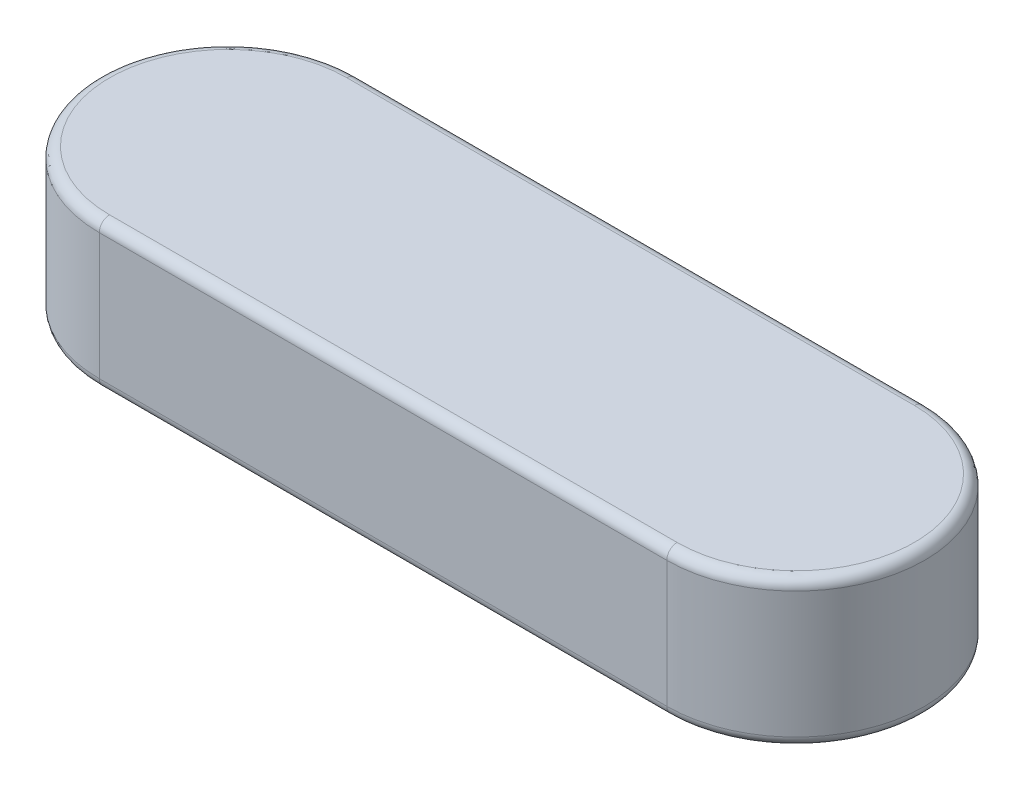
ISO-10303-21;
HEADER;
FILE_DESCRIPTION(('STEP AP214'),'2;1');
FILE_NAME('part.step','',(''),(''),'','','');
FILE_SCHEMA(('AUTOMOTIVE_DESIGN { 1 0 10303 214 1 1 1 1 }'));
ENDSEC;
DATA;
#1=APPLICATION_CONTEXT('core data for automotive mechanical design processes');
#2=APPLICATION_PROTOCOL_DEFINITION('international standard','automotive_design',2000,#1);
#3=PRODUCT_CONTEXT('',#1,'mechanical');
#4=PRODUCT('Part','Part','',(#3));
#5=PRODUCT_RELATED_PRODUCT_CATEGORY('part','',(#4));
#6=PRODUCT_DEFINITION_FORMATION('','',#4);
#7=PRODUCT_DEFINITION_CONTEXT('part definition',#1,'design');
#8=PRODUCT_DEFINITION('design','',#6,#7);
#9=PRODUCT_DEFINITION_SHAPE('','',#8);
#10=(LENGTH_UNIT() NAMED_UNIT(*) SI_UNIT(.MILLI.,.METRE.));
#11=(NAMED_UNIT(*) PLANE_ANGLE_UNIT() SI_UNIT($,.RADIAN.));
#12=(NAMED_UNIT(*) SI_UNIT($,.STERADIAN.) SOLID_ANGLE_UNIT());
#13=UNCERTAINTY_MEASURE_WITH_UNIT(LENGTH_MEASURE(1.E-05),#10,'distance_accuracy_value','');
#14=(GEOMETRIC_REPRESENTATION_CONTEXT(3) GLOBAL_UNCERTAINTY_ASSIGNED_CONTEXT((#13)) GLOBAL_UNIT_ASSIGNED_CONTEXT((#10,
#11,#12)) REPRESENTATION_CONTEXT('',''));
#15=CARTESIAN_POINT('',(0.,0.,0.));
#16=DIRECTION('',(0.,0.,1.));
#17=DIRECTION('',(1.,0.,0.));
#18=AXIS2_PLACEMENT_3D('',#15,#16,#17);
#19=CARTESIAN_POINT('',(-22.,5.7,0.));
#20=DIRECTION('',(0.,-1.,0.));
#21=DIRECTION('',(0.,0.,-1.));
#22=AXIS2_PLACEMENT_3D('',#19,#20,#21);
#23=CYLINDRICAL_SURFACE('',#22,5.);
#24=DIRECTION('',(0.,-1.,0.));
#25=VECTOR('',#24,1.);
#26=CARTESIAN_POINT('',(-22.,5.7,-5.));
#27=LINE('',#26,#25);
#28=CARTESIAN_POINT('',(-22.,5.3,-5.));
#29=VERTEX_POINT('',#28);
#30=CARTESIAN_POINT('',(-22.,0.4,-5.));
#31=VERTEX_POINT('',#30);
#32=EDGE_CURVE('E106',#29,#31,#27,.T.);
#33=ORIENTED_EDGE('',*,*,#32,.T.);
#34=CARTESIAN_POINT('',(-22.,0.4,0.));
#35=DIRECTION('',(0.,1.,0.));
#36=DIRECTION('',(0.,0.,1.));
#37=AXIS2_PLACEMENT_3D('',#34,#35,#36);
#38=CIRCLE('',#37,5.);
#39=CARTESIAN_POINT('',(-22.,0.4,5.));
#40=VERTEX_POINT('',#39);
#41=EDGE_CURVE('E113',#31,#40,#38,.T.);
#42=ORIENTED_EDGE('',*,*,#41,.T.);
#43=DIRECTION('',(0.,-1.,0.));
#44=VECTOR('',#43,1.);
#45=CARTESIAN_POINT('',(-22.,5.7,5.));
#46=LINE('',#45,#44);
#47=CARTESIAN_POINT('',(-22.,5.3,5.));
#48=VERTEX_POINT('',#47);
#49=EDGE_CURVE('E108',#48,#40,#46,.T.);
#50=ORIENTED_EDGE('',*,*,#49,.F.);
#51=CARTESIAN_POINT('',(-22.,5.3,0.));
#52=DIRECTION('',(0.,1.,0.));
#53=DIRECTION('',(0.,0.,1.));
#54=AXIS2_PLACEMENT_3D('',#51,#52,#53);
#55=CIRCLE('',#54,5.);
#56=EDGE_CURVE('E104',#48,#29,#55,.F.);
#57=ORIENTED_EDGE('',*,*,#56,.T.);
#58=EDGE_LOOP('',(#33,#42,#50,#57));
#59=FACE_BOUND('',#58,.T.);
#60=ADVANCED_FACE('F35',(#59),#23,.T.);
#61=CARTESIAN_POINT('',(-22.,5.7,5.));
#62=DIRECTION('',(0.,0.,-1.));
#63=DIRECTION('',(-1.,0.,0.));
#64=AXIS2_PLACEMENT_3D('',#61,#62,#63);
#65=PLANE('',#64);
#66=ORIENTED_EDGE('',*,*,#49,.T.);
#67=DIRECTION('',(1.,0.,0.));
#68=VECTOR('',#67,1.);
#69=CARTESIAN_POINT('',(-22.,0.4,5.));
#70=LINE('',#69,#68);
#71=CARTESIAN_POINT('',(0.,0.4,5.));
#72=VERTEX_POINT('',#71);
#73=EDGE_CURVE('E157',#40,#72,#70,.T.);
#74=ORIENTED_EDGE('',*,*,#73,.T.);
#75=DIRECTION('',(0.,-1.,0.));
#76=VECTOR('',#75,1.);
#77=CARTESIAN_POINT('',(0.,5.7,5.));
#78=LINE('',#77,#76);
#79=CARTESIAN_POINT('',(0.,5.3,5.));
#80=VERTEX_POINT('',#79);
#81=EDGE_CURVE('E138',#80,#72,#78,.T.);
#82=ORIENTED_EDGE('',*,*,#81,.F.);
#83=DIRECTION('',(1.,0.,0.));
#84=VECTOR('',#83,1.);
#85=CARTESIAN_POINT('',(-22.,5.3,5.));
#86=LINE('',#85,#84);
#87=EDGE_CURVE('E155',#80,#48,#86,.F.);
#88=ORIENTED_EDGE('',*,*,#87,.T.);
#89=EDGE_LOOP('',(#66,#74,#82,#88));
#90=FACE_BOUND('',#89,.T.);
#91=ADVANCED_FACE('F183',(#90),#65,.F.);
#92=CARTESIAN_POINT('',(0.,5.7,0.));
#93=DIRECTION('',(0.,-1.,0.));
#94=DIRECTION('',(0.,0.,-1.));
#95=AXIS2_PLACEMENT_3D('',#92,#93,#94);
#96=CYLINDRICAL_SURFACE('',#95,5.);
#97=ORIENTED_EDGE('',*,*,#81,.T.);
#98=CARTESIAN_POINT('',(0.,0.4,0.));
#99=DIRECTION('',(0.,1.,0.));
#100=DIRECTION('',(0.,0.,1.));
#101=AXIS2_PLACEMENT_3D('',#98,#99,#100);
#102=CIRCLE('',#101,5.);
#103=CARTESIAN_POINT('',(0.,0.4,-5.));
#104=VERTEX_POINT('',#103);
#105=EDGE_CURVE('E114',#72,#104,#102,.T.);
#106=ORIENTED_EDGE('',*,*,#105,.T.);
#107=DIRECTION('',(0.,-1.,0.));
#108=VECTOR('',#107,1.);
#109=CARTESIAN_POINT('',(0.,5.7,-5.));
#110=LINE('',#109,#108);
#111=CARTESIAN_POINT('',(0.,5.3,-5.));
#112=VERTEX_POINT('',#111);
#113=EDGE_CURVE('E125',#112,#104,#110,.T.);
#114=ORIENTED_EDGE('',*,*,#113,.F.);
#115=CARTESIAN_POINT('',(0.,5.3,0.));
#116=DIRECTION('',(0.,1.,0.));
#117=DIRECTION('',(0.,0.,1.));
#118=AXIS2_PLACEMENT_3D('',#115,#116,#117);
#119=CIRCLE('',#118,5.);
#120=EDGE_CURVE('E150',#112,#80,#119,.F.);
#121=ORIENTED_EDGE('',*,*,#120,.T.);
#122=EDGE_LOOP('',(#97,#106,#114,#121));
#123=FACE_BOUND('',#122,.T.);
#124=ADVANCED_FACE('F181',(#123),#96,.T.);
#125=CARTESIAN_POINT('',(-22.,5.7,-5.));
#126=DIRECTION('',(0.,0.,1.));
#127=DIRECTION('',(1.,0.,0.));
#128=AXIS2_PLACEMENT_3D('',#125,#126,#127);
#129=PLANE('',#128);
#130=ORIENTED_EDGE('',*,*,#113,.T.);
#131=DIRECTION('',(-1.,0.,0.));
#132=VECTOR('',#131,1.);
#133=CARTESIAN_POINT('',(-22.,0.4,-5.));
#134=LINE('',#133,#132);
#135=EDGE_CURVE('E124',#104,#31,#134,.T.);
#136=ORIENTED_EDGE('',*,*,#135,.T.);
#137=ORIENTED_EDGE('',*,*,#32,.F.);
#138=DIRECTION('',(-1.,0.,0.));
#139=VECTOR('',#138,1.);
#140=CARTESIAN_POINT('',(0.,5.3,-5.));
#141=LINE('',#140,#139);
#142=EDGE_CURVE('E121',#29,#112,#141,.F.);
#143=ORIENTED_EDGE('',*,*,#142,.T.);
#144=EDGE_LOOP('',(#130,#136,#137,#143));
#145=FACE_BOUND('',#144,.T.);
#146=ADVANCED_FACE('F119',(#145),#129,.F.);
#147=CARTESIAN_POINT('',(-22.,5.7,0.));
#148=DIRECTION('',(0.,1.,0.));
#149=DIRECTION('',(0.,0.,1.));
#150=AXIS2_PLACEMENT_3D('',#147,#148,#149);
#151=PLANE('',#150);
#152=DIRECTION('',(1.,0.,0.));
#153=VECTOR('',#152,1.);
#154=CARTESIAN_POINT('',(0.,5.7,4.6));
#155=LINE('',#154,#153);
#156=CARTESIAN_POINT('',(-22.,5.7,4.6));
#157=VERTEX_POINT('',#156);
#158=CARTESIAN_POINT('',(0.,5.7,4.6));
#159=VERTEX_POINT('',#158);
#160=EDGE_CURVE('E44',#157,#159,#155,.T.);
#161=ORIENTED_EDGE('',*,*,#160,.T.);
#162=CARTESIAN_POINT('',(0.,5.7,0.));
#163=DIRECTION('',(0.,1.,0.));
#164=DIRECTION('',(0.,0.,1.));
#165=AXIS2_PLACEMENT_3D('',#162,#163,#164);
#166=CIRCLE('',#165,4.6);
#167=CARTESIAN_POINT('',(0.,5.7,-4.6));
#168=VERTEX_POINT('',#167);
#169=EDGE_CURVE('E11',#159,#168,#166,.T.);
#170=ORIENTED_EDGE('',*,*,#169,.T.);
#171=DIRECTION('',(-1.,0.,0.));
#172=VECTOR('',#171,1.);
#173=CARTESIAN_POINT('',(-22.,5.7,-4.6));
#174=LINE('',#173,#172);
#175=CARTESIAN_POINT('',(-22.,5.7,-4.6));
#176=VERTEX_POINT('',#175);
#177=EDGE_CURVE('E160',#168,#176,#174,.T.);
#178=ORIENTED_EDGE('',*,*,#177,.T.);
#179=CARTESIAN_POINT('',(-22.,5.7,0.));
#180=DIRECTION('',(0.,1.,0.));
#181=DIRECTION('',(0.,0.,1.));
#182=AXIS2_PLACEMENT_3D('',#179,#180,#181);
#183=CIRCLE('',#182,4.6);
#184=EDGE_CURVE('E131',#176,#157,#183,.T.);
#185=ORIENTED_EDGE('',*,*,#184,.T.);
#186=EDGE_LOOP('',(#161,#170,#178,#185));
#187=FACE_BOUND('',#186,.T.);
#188=ADVANCED_FACE('F206',(#187),#151,.T.);
#189=CARTESIAN_POINT('',(-22.,0.,0.));
#190=DIRECTION('',(0.,1.,0.));
#191=DIRECTION('',(0.,0.,1.));
#192=AXIS2_PLACEMENT_3D('',#189,#190,#191);
#193=PLANE('',#192);
#194=CARTESIAN_POINT('',(-22.,0.,0.));
#195=DIRECTION('',(0.,1.,0.));
#196=DIRECTION('',(0.,0.,1.));
#197=AXIS2_PLACEMENT_3D('',#194,#195,#196);
#198=CIRCLE('',#197,4.6);
#199=CARTESIAN_POINT('',(-22.,0.,4.6));
#200=VERTEX_POINT('',#199);
#201=CARTESIAN_POINT('',(-22.,0.,-4.6));
#202=VERTEX_POINT('',#201);
#203=EDGE_CURVE('E143',#200,#202,#198,.F.);
#204=ORIENTED_EDGE('',*,*,#203,.T.);
#205=DIRECTION('',(-1.,0.,0.));
#206=VECTOR('',#205,1.);
#207=CARTESIAN_POINT('',(-22.,0.,-4.6));
#208=LINE('',#207,#206);
#209=CARTESIAN_POINT('',(0.,0.,-4.6));
#210=VERTEX_POINT('',#209);
#211=EDGE_CURVE('E147',#202,#210,#208,.F.);
#212=ORIENTED_EDGE('',*,*,#211,.T.);
#213=CARTESIAN_POINT('',(0.,0.,0.));
#214=DIRECTION('',(0.,1.,0.));
#215=DIRECTION('',(0.,0.,1.));
#216=AXIS2_PLACEMENT_3D('',#213,#214,#215);
#217=CIRCLE('',#216,4.6);
#218=CARTESIAN_POINT('',(0.,0.,4.6));
#219=VERTEX_POINT('',#218);
#220=EDGE_CURVE('E145',#210,#219,#217,.F.);
#221=ORIENTED_EDGE('',*,*,#220,.T.);
#222=DIRECTION('',(1.,0.,0.));
#223=VECTOR('',#222,1.);
#224=CARTESIAN_POINT('',(-22.,0.,4.6));
#225=LINE('',#224,#223);
#226=EDGE_CURVE('E136',#219,#200,#225,.F.);
#227=ORIENTED_EDGE('',*,*,#226,.T.);
#228=EDGE_LOOP('',(#204,#212,#221,#227));
#229=FACE_BOUND('',#228,.T.);
#230=ADVANCED_FACE('F204',(#229),#193,.F.);
#231=CARTESIAN_POINT('',(-22.,0.4,4.6));
#232=DIRECTION('',(1.,0.,0.));
#233=DIRECTION('',(0.,0.,-1.));
#234=AXIS2_PLACEMENT_3D('',#231,#232,#233);
#235=CYLINDRICAL_SURFACE('',#234,0.4);
#236=CARTESIAN_POINT('',(-22.,0.4,4.6));
#237=DIRECTION('',(-1.,0.,0.));
#238=DIRECTION('',(0.,0.,1.));
#239=AXIS2_PLACEMENT_3D('',#236,#237,#238);
#240=CIRCLE('',#239,0.4);
#241=EDGE_CURVE('E167',#200,#40,#240,.T.);
#242=ORIENTED_EDGE('',*,*,#241,.F.);
#243=ORIENTED_EDGE('',*,*,#226,.F.);
#244=CARTESIAN_POINT('',(0.,0.4,4.6));
#245=DIRECTION('',(1.,0.,0.));
#246=DIRECTION('',(0.,0.,-1.));
#247=AXIS2_PLACEMENT_3D('',#244,#245,#246);
#248=CIRCLE('',#247,0.4);
#249=EDGE_CURVE('E126',#72,#219,#248,.T.);
#250=ORIENTED_EDGE('',*,*,#249,.F.);
#251=ORIENTED_EDGE('',*,*,#73,.F.);
#252=EDGE_LOOP('',(#242,#243,#250,#251));
#253=FACE_BOUND('',#252,.T.);
#254=ADVANCED_FACE('F201',(#253),#235,.T.);
#255=CARTESIAN_POINT('',(0.,0.4,0.));
#256=DIRECTION('',(0.,1.,0.));
#257=DIRECTION('',(0.,0.,1.));
#258=AXIS2_PLACEMENT_3D('',#255,#256,#257);
#259=TOROIDAL_SURFACE('',#258,4.6,0.4);
#260=ORIENTED_EDGE('',*,*,#249,.T.);
#261=ORIENTED_EDGE('',*,*,#220,.F.);
#262=CARTESIAN_POINT('',(0.,0.4,-4.6));
#263=DIRECTION('',(-1.,0.,0.));
#264=DIRECTION('',(0.,0.,1.));
#265=AXIS2_PLACEMENT_3D('',#262,#263,#264);
#266=CIRCLE('',#265,0.4);
#267=EDGE_CURVE('E165',#104,#210,#266,.T.);
#268=ORIENTED_EDGE('',*,*,#267,.F.);
#269=ORIENTED_EDGE('',*,*,#105,.F.);
#270=EDGE_LOOP('',(#260,#261,#268,#269));
#271=FACE_BOUND('',#270,.T.);
#272=ADVANCED_FACE('F190',(#271),#259,.T.);
#273=CARTESIAN_POINT('',(-22.,0.4,0.));
#274=DIRECTION('',(0.,1.,0.));
#275=DIRECTION('',(0.,0.,1.));
#276=AXIS2_PLACEMENT_3D('',#273,#274,#275);
#277=TOROIDAL_SURFACE('',#276,4.6,0.4);
#278=ORIENTED_EDGE('',*,*,#241,.T.);
#279=ORIENTED_EDGE('',*,*,#41,.F.);
#280=CARTESIAN_POINT('',(-22.,0.4,-4.6));
#281=DIRECTION('',(1.,0.,0.));
#282=DIRECTION('',(0.,0.,-1.));
#283=AXIS2_PLACEMENT_3D('',#280,#281,#282);
#284=CIRCLE('',#283,0.4);
#285=EDGE_CURVE('E163',#202,#31,#284,.T.);
#286=ORIENTED_EDGE('',*,*,#285,.F.);
#287=ORIENTED_EDGE('',*,*,#203,.F.);
#288=EDGE_LOOP('',(#278,#279,#286,#287));
#289=FACE_BOUND('',#288,.T.);
#290=ADVANCED_FACE('F198',(#289),#277,.T.);
#291=CARTESIAN_POINT('',(-22.,0.4,-4.6));
#292=DIRECTION('',(-1.,0.,0.));
#293=DIRECTION('',(0.,0.,1.));
#294=AXIS2_PLACEMENT_3D('',#291,#292,#293);
#295=CYLINDRICAL_SURFACE('',#294,0.4);
#296=ORIENTED_EDGE('',*,*,#267,.T.);
#297=ORIENTED_EDGE('',*,*,#211,.F.);
#298=ORIENTED_EDGE('',*,*,#285,.T.);
#299=ORIENTED_EDGE('',*,*,#135,.F.);
#300=EDGE_LOOP('',(#296,#297,#298,#299));
#301=FACE_BOUND('',#300,.T.);
#302=ADVANCED_FACE('F193',(#301),#295,.T.);
#303=CARTESIAN_POINT('',(-22.,5.3,0.));
#304=DIRECTION('',(0.,1.,0.));
#305=DIRECTION('',(0.,0.,1.));
#306=AXIS2_PLACEMENT_3D('',#303,#304,#305);
#307=TOROIDAL_SURFACE('',#306,4.6,0.4);
#308=CARTESIAN_POINT('',(-22.,5.3,-4.6));
#309=DIRECTION('',(1.,0.,0.));
#310=DIRECTION('',(0.,0.,-1.));
#311=AXIS2_PLACEMENT_3D('',#308,#309,#310);
#312=CIRCLE('',#311,0.4);
#313=EDGE_CURVE('E130',#29,#176,#312,.T.);
#314=ORIENTED_EDGE('',*,*,#313,.F.);
#315=ORIENTED_EDGE('',*,*,#56,.F.);
#316=CARTESIAN_POINT('',(-22.,5.3,4.6));
#317=DIRECTION('',(1.,0.,0.));
#318=DIRECTION('',(0.,0.,-1.));
#319=AXIS2_PLACEMENT_3D('',#316,#317,#318);
#320=CIRCLE('',#319,0.4);
#321=EDGE_CURVE('E39',#157,#48,#320,.T.);
#322=ORIENTED_EDGE('',*,*,#321,.F.);
#323=ORIENTED_EDGE('',*,*,#184,.F.);
#324=EDGE_LOOP('',(#314,#315,#322,#323));
#325=FACE_BOUND('',#324,.T.);
#326=ADVANCED_FACE('F37',(#325),#307,.T.);
#327=CARTESIAN_POINT('',(-22.,5.3,4.6));
#328=DIRECTION('',(-1.,0.,0.));
#329=DIRECTION('',(0.,0.,1.));
#330=AXIS2_PLACEMENT_3D('',#327,#328,#329);
#331=CYLINDRICAL_SURFACE('',#330,0.4);
#332=ORIENTED_EDGE('',*,*,#321,.T.);
#333=ORIENTED_EDGE('',*,*,#87,.F.);
#334=CARTESIAN_POINT('',(0.,5.3,4.6));
#335=DIRECTION('',(1.,0.,0.));
#336=DIRECTION('',(0.,0.,-1.));
#337=AXIS2_PLACEMENT_3D('',#334,#335,#336);
#338=CIRCLE('',#337,0.4);
#339=EDGE_CURVE('E133',#159,#80,#338,.T.);
#340=ORIENTED_EDGE('',*,*,#339,.F.);
#341=ORIENTED_EDGE('',*,*,#160,.F.);
#342=EDGE_LOOP('',(#332,#333,#340,#341));
#343=FACE_BOUND('',#342,.T.);
#344=ADVANCED_FACE('F176',(#343),#331,.T.);
#345=CARTESIAN_POINT('',(-22.,5.3,-4.6));
#346=DIRECTION('',(1.,0.,0.));
#347=DIRECTION('',(0.,0.,-1.));
#348=AXIS2_PLACEMENT_3D('',#345,#346,#347);
#349=CYLINDRICAL_SURFACE('',#348,0.4);
#350=ORIENTED_EDGE('',*,*,#313,.T.);
#351=ORIENTED_EDGE('',*,*,#177,.F.);
#352=CARTESIAN_POINT('',(0.,5.3,-4.6));
#353=DIRECTION('',(1.,0.,0.));
#354=DIRECTION('',(0.,0.,-1.));
#355=AXIS2_PLACEMENT_3D('',#352,#353,#354);
#356=CIRCLE('',#355,0.4);
#357=EDGE_CURVE('E58',#112,#168,#356,.T.);
#358=ORIENTED_EDGE('',*,*,#357,.F.);
#359=ORIENTED_EDGE('',*,*,#142,.F.);
#360=EDGE_LOOP('',(#350,#351,#358,#359));
#361=FACE_BOUND('',#360,.T.);
#362=ADVANCED_FACE('F134',(#361),#349,.T.);
#363=CARTESIAN_POINT('',(0.,5.3,0.));
#364=DIRECTION('',(0.,1.,0.));
#365=DIRECTION('',(0.,0.,1.));
#366=AXIS2_PLACEMENT_3D('',#363,#364,#365);
#367=TOROIDAL_SURFACE('',#366,4.6,0.4);
#368=ORIENTED_EDGE('',*,*,#339,.T.);
#369=ORIENTED_EDGE('',*,*,#120,.F.);
#370=ORIENTED_EDGE('',*,*,#357,.T.);
#371=ORIENTED_EDGE('',*,*,#169,.F.);
#372=EDGE_LOOP('',(#368,#369,#370,#371));
#373=FACE_BOUND('',#372,.T.);
#374=ADVANCED_FACE('F174',(#373),#367,.T.);
#375=CLOSED_SHELL('',(#60,#91,#124,#146,#188,#230,#254,#272,#290,#302,#326,#344,#362,#374));
#376=MANIFOLD_SOLID_BREP('B2',#375);
#377=ADVANCED_BREP_SHAPE_REPRESENTATION('',(#18,#376),#14);
#378=SHAPE_DEFINITION_REPRESENTATION(#9,#377);
ENDSEC;
END-ISO-10303-21;
